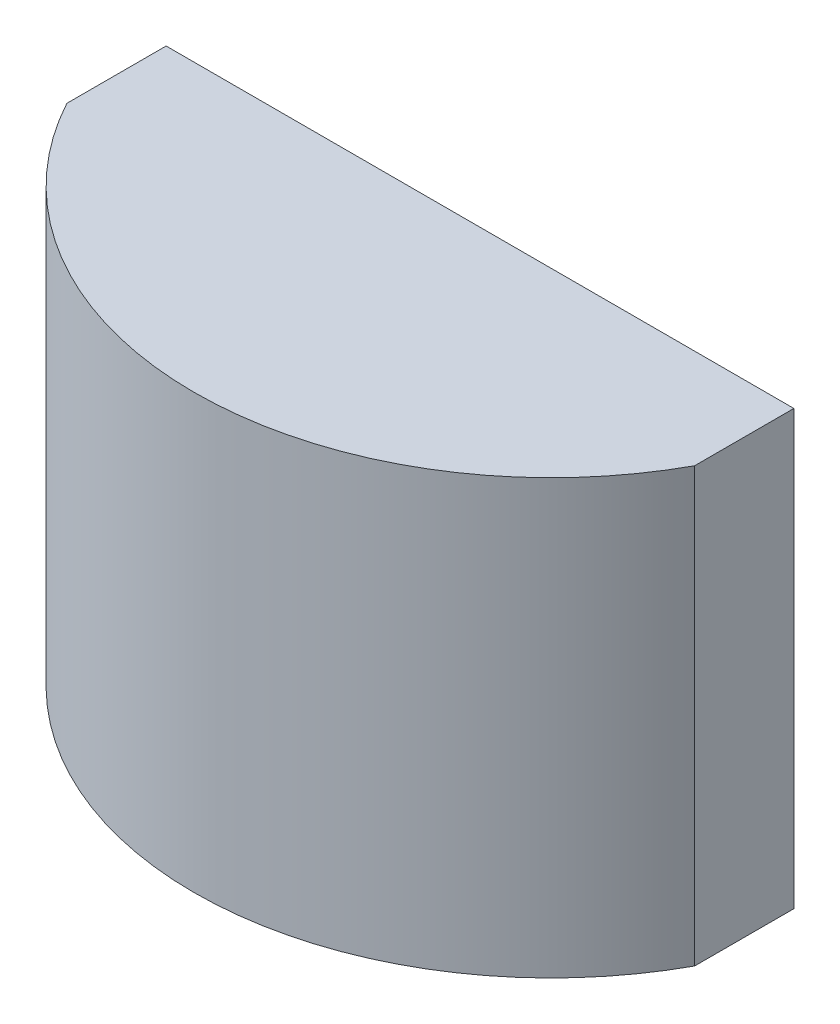
ISO-10303-21;
HEADER;
FILE_DESCRIPTION(('STEP AP214'),'2;1');
FILE_NAME('part.step','',(''),(''),'','','');
FILE_SCHEMA(('AUTOMOTIVE_DESIGN { 1 0 10303 214 1 1 1 1 }'));
ENDSEC;
DATA;
#1=APPLICATION_CONTEXT('core data for automotive mechanical design processes');
#2=APPLICATION_PROTOCOL_DEFINITION('international standard','automotive_design',2000,#1);
#3=PRODUCT_CONTEXT('',#1,'mechanical');
#4=PRODUCT('Part','Part','',(#3));
#5=PRODUCT_RELATED_PRODUCT_CATEGORY('part','',(#4));
#6=PRODUCT_DEFINITION_FORMATION('','',#4);
#7=PRODUCT_DEFINITION_CONTEXT('part definition',#1,'design');
#8=PRODUCT_DEFINITION('design','',#6,#7);
#9=PRODUCT_DEFINITION_SHAPE('','',#8);
#10=(LENGTH_UNIT() NAMED_UNIT(*) SI_UNIT(.MILLI.,.METRE.));
#11=(NAMED_UNIT(*) PLANE_ANGLE_UNIT() SI_UNIT($,.RADIAN.));
#12=(NAMED_UNIT(*) SI_UNIT($,.STERADIAN.) SOLID_ANGLE_UNIT());
#13=UNCERTAINTY_MEASURE_WITH_UNIT(LENGTH_MEASURE(1.E-05),#10,'distance_accuracy_value','');
#14=(GEOMETRIC_REPRESENTATION_CONTEXT(3) GLOBAL_UNCERTAINTY_ASSIGNED_CONTEXT((#13)) GLOBAL_UNIT_ASSIGNED_CONTEXT((#10,
#11,#12)) REPRESENTATION_CONTEXT('',''));
#15=CARTESIAN_POINT('',(0.,0.,0.));
#16=DIRECTION('',(0.,0.,1.));
#17=DIRECTION('',(1.,0.,0.));
#18=AXIS2_PLACEMENT_3D('',#15,#16,#17);
#19=CARTESIAN_POINT('',(65.2,90.,35.4203331435491));
#20=DIRECTION('',(-1.,0.,0.));
#21=DIRECTION('',(0.,0.,1.));
#22=AXIS2_PLACEMENT_3D('',#19,#20,#21);
#23=PLANE('',#22);
#24=DIRECTION('',(0.,0.,-1.));
#25=VECTOR('',#24,1.);
#26=CARTESIAN_POINT('',(65.2,0.,35.4203331435491));
#27=LINE('',#26,#25);
#28=CARTESIAN_POINT('',(65.2,0.,35.4203331435491));
#29=VERTEX_POINT('',#28);
#30=CARTESIAN_POINT('',(65.2,0.,14.8));
#31=VERTEX_POINT('',#30);
#32=EDGE_CURVE('E107',#29,#31,#27,.T.);
#33=ORIENTED_EDGE('',*,*,#32,.T.);
#34=DIRECTION('',(0.,-1.,0.));
#35=VECTOR('',#34,1.);
#36=CARTESIAN_POINT('',(65.2,90.,14.8));
#37=LINE('',#36,#35);
#38=CARTESIAN_POINT('',(65.2,90.,14.8));
#39=VERTEX_POINT('',#38);
#40=EDGE_CURVE('E11',#39,#31,#37,.T.);
#41=ORIENTED_EDGE('',*,*,#40,.F.);
#42=DIRECTION('',(0.,0.,-1.));
#43=VECTOR('',#42,1.);
#44=CARTESIAN_POINT('',(65.2,90.,35.4203331435491));
#45=LINE('',#44,#43);
#46=CARTESIAN_POINT('',(65.2,90.,35.4203331435491));
#47=VERTEX_POINT('',#46);
#48=EDGE_CURVE('E91',#47,#39,#45,.T.);
#49=ORIENTED_EDGE('',*,*,#48,.F.);
#50=DIRECTION('',(0.,-1.,0.));
#51=VECTOR('',#50,1.);
#52=CARTESIAN_POINT('',(65.2,90.,35.4203331435491));
#53=LINE('',#52,#51);
#54=EDGE_CURVE('E103',#47,#29,#53,.T.);
#55=ORIENTED_EDGE('',*,*,#54,.T.);
#56=EDGE_LOOP('',(#33,#41,#49,#55));
#57=FACE_BOUND('',#56,.T.);
#58=ADVANCED_FACE('F39',(#57),#23,.F.);
#59=CARTESIAN_POINT('',(65.2,90.,14.8));
#60=DIRECTION('',(0.,0.,1.));
#61=DIRECTION('',(1.,0.,0.));
#62=AXIS2_PLACEMENT_3D('',#59,#60,#61);
#63=PLANE('',#62);
#64=DIRECTION('',(-1.,0.,0.));
#65=VECTOR('',#64,1.);
#66=CARTESIAN_POINT('',(65.2,0.,14.8));
#67=LINE('',#66,#65);
#68=CARTESIAN_POINT('',(-65.2,0.,14.8));
#69=VERTEX_POINT('',#68);
#70=EDGE_CURVE('E96',#31,#69,#67,.T.);
#71=ORIENTED_EDGE('',*,*,#70,.T.);
#72=DIRECTION('',(0.,-1.,0.));
#73=VECTOR('',#72,1.);
#74=CARTESIAN_POINT('',(-65.2,90.,14.8));
#75=LINE('',#74,#73);
#76=CARTESIAN_POINT('',(-65.2,90.,14.8));
#77=VERTEX_POINT('',#76);
#78=EDGE_CURVE('E48',#77,#69,#75,.T.);
#79=ORIENTED_EDGE('',*,*,#78,.F.);
#80=DIRECTION('',(-1.,0.,0.));
#81=VECTOR('',#80,1.);
#82=CARTESIAN_POINT('',(65.2,90.,14.8));
#83=LINE('',#82,#81);
#84=EDGE_CURVE('E86',#39,#77,#83,.T.);
#85=ORIENTED_EDGE('',*,*,#84,.F.);
#86=ORIENTED_EDGE('',*,*,#40,.T.);
#87=EDGE_LOOP('',(#71,#79,#85,#86));
#88=FACE_BOUND('',#87,.T.);
#89=ADVANCED_FACE('F95',(#88),#63,.F.);
#90=CARTESIAN_POINT('',(-65.2,90.,14.8));
#91=DIRECTION('',(1.,0.,0.));
#92=DIRECTION('',(0.,0.,-1.));
#93=AXIS2_PLACEMENT_3D('',#90,#91,#92);
#94=PLANE('',#93);
#95=DIRECTION('',(0.,0.,1.));
#96=VECTOR('',#95,1.);
#97=CARTESIAN_POINT('',(-65.2,0.,14.8));
#98=LINE('',#97,#96);
#99=CARTESIAN_POINT('',(-65.2,0.,35.4203331435491));
#100=VERTEX_POINT('',#99);
#101=EDGE_CURVE('E73',#69,#100,#98,.T.);
#102=ORIENTED_EDGE('',*,*,#101,.T.);
#103=DIRECTION('',(0.,-1.,0.));
#104=VECTOR('',#103,1.);
#105=CARTESIAN_POINT('',(-65.2,90.,35.4203331435491));
#106=LINE('',#105,#104);
#107=CARTESIAN_POINT('',(-65.2,90.,35.4203331435491));
#108=VERTEX_POINT('',#107);
#109=EDGE_CURVE('E98',#108,#100,#106,.T.);
#110=ORIENTED_EDGE('',*,*,#109,.F.);
#111=DIRECTION('',(0.,0.,1.));
#112=VECTOR('',#111,1.);
#113=CARTESIAN_POINT('',(-65.2,90.,14.8));
#114=LINE('',#113,#112);
#115=EDGE_CURVE('E89',#77,#108,#114,.T.);
#116=ORIENTED_EDGE('',*,*,#115,.F.);
#117=ORIENTED_EDGE('',*,*,#78,.T.);
#118=EDGE_LOOP('',(#102,#110,#116,#117));
#119=FACE_BOUND('',#118,.T.);
#120=ADVANCED_FACE('F99',(#119),#94,.F.);
#121=CARTESIAN_POINT('',(0.,90.,0.));
#122=DIRECTION('',(0.,-1.,0.));
#123=DIRECTION('',(0.,0.,-1.));
#124=AXIS2_PLACEMENT_3D('',#121,#122,#123);
#125=CYLINDRICAL_SURFACE('',#124,74.2);
#126=CARTESIAN_POINT('',(0.,0.,0.));
#127=DIRECTION('',(0.,1.,0.));
#128=DIRECTION('',(0.,0.,1.));
#129=AXIS2_PLACEMENT_3D('',#126,#127,#128);
#130=CIRCLE('',#129,74.2);
#131=EDGE_CURVE('E79',#100,#29,#130,.T.);
#132=ORIENTED_EDGE('',*,*,#131,.T.);
#133=ORIENTED_EDGE('',*,*,#54,.F.);
#134=CARTESIAN_POINT('',(0.,90.,0.));
#135=DIRECTION('',(0.,1.,0.));
#136=DIRECTION('',(0.,0.,1.));
#137=AXIS2_PLACEMENT_3D('',#134,#135,#136);
#138=CIRCLE('',#137,74.2);
#139=EDGE_CURVE('E56',#108,#47,#138,.T.);
#140=ORIENTED_EDGE('',*,*,#139,.F.);
#141=ORIENTED_EDGE('',*,*,#109,.T.);
#142=EDGE_LOOP('',(#132,#133,#140,#141));
#143=FACE_BOUND('',#142,.T.);
#144=ADVANCED_FACE('F120',(#143),#125,.T.);
#145=CARTESIAN_POINT('',(0.,90.,0.));
#146=DIRECTION('',(0.,1.,0.));
#147=DIRECTION('',(0.,0.,1.));
#148=AXIS2_PLACEMENT_3D('',#145,#146,#147);
#149=PLANE('',#148);
#150=ORIENTED_EDGE('',*,*,#48,.T.);
#151=ORIENTED_EDGE('',*,*,#84,.T.);
#152=ORIENTED_EDGE('',*,*,#115,.T.);
#153=ORIENTED_EDGE('',*,*,#139,.T.);
#154=EDGE_LOOP('',(#150,#151,#152,#153));
#155=FACE_BOUND('',#154,.T.);
#156=ADVANCED_FACE('F87',(#155),#149,.T.);
#157=CARTESIAN_POINT('',(0.,0.,0.));
#158=DIRECTION('',(0.,1.,0.));
#159=DIRECTION('',(0.,0.,1.));
#160=AXIS2_PLACEMENT_3D('',#157,#158,#159);
#161=PLANE('',#160);
#162=ORIENTED_EDGE('',*,*,#32,.F.);
#163=ORIENTED_EDGE('',*,*,#131,.F.);
#164=ORIENTED_EDGE('',*,*,#101,.F.);
#165=ORIENTED_EDGE('',*,*,#70,.F.);
#166=EDGE_LOOP('',(#162,#163,#164,#165));
#167=FACE_BOUND('',#166,.T.);
#168=ADVANCED_FACE('F123',(#167),#161,.F.);
#169=CLOSED_SHELL('',(#58,#89,#120,#144,#156,#168));
#170=MANIFOLD_SOLID_BREP('B2',#169);
#171=ADVANCED_BREP_SHAPE_REPRESENTATION('',(#18,#170),#14);
#172=SHAPE_DEFINITION_REPRESENTATION(#9,#171);
ENDSEC;
END-ISO-10303-21;
